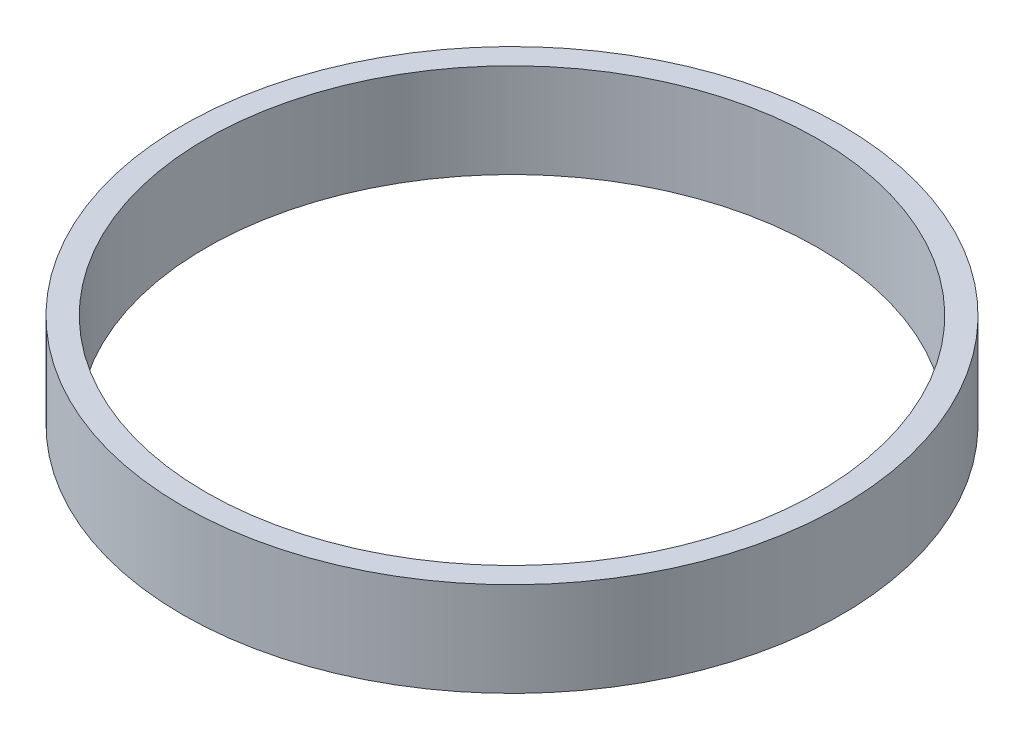
ISO-10303-21;
HEADER;
FILE_DESCRIPTION(('STEP AP214'),'2;1');
FILE_NAME('part.step','',(''),(''),'','','');
FILE_SCHEMA(('AUTOMOTIVE_DESIGN { 1 0 10303 214 1 1 1 1 }'));
ENDSEC;
DATA;
#1=APPLICATION_CONTEXT('core data for automotive mechanical design processes');
#2=APPLICATION_PROTOCOL_DEFINITION('international standard','automotive_design',2000,#1);
#3=PRODUCT_CONTEXT('',#1,'mechanical');
#4=PRODUCT('Part','Part','',(#3));
#5=PRODUCT_RELATED_PRODUCT_CATEGORY('part','',(#4));
#6=PRODUCT_DEFINITION_FORMATION('','',#4);
#7=PRODUCT_DEFINITION_CONTEXT('part definition',#1,'design');
#8=PRODUCT_DEFINITION('design','',#6,#7);
#9=PRODUCT_DEFINITION_SHAPE('','',#8);
#10=(LENGTH_UNIT() NAMED_UNIT(*) SI_UNIT(.MILLI.,.METRE.));
#11=(NAMED_UNIT(*) PLANE_ANGLE_UNIT() SI_UNIT($,.RADIAN.));
#12=(NAMED_UNIT(*) SI_UNIT($,.STERADIAN.) SOLID_ANGLE_UNIT());
#13=UNCERTAINTY_MEASURE_WITH_UNIT(LENGTH_MEASURE(1.E-05),#10,'distance_accuracy_value','');
#14=(GEOMETRIC_REPRESENTATION_CONTEXT(3) GLOBAL_UNCERTAINTY_ASSIGNED_CONTEXT((#13)) GLOBAL_UNIT_ASSIGNED_CONTEXT((#10,
#11,#12)) REPRESENTATION_CONTEXT('',''));
#15=CARTESIAN_POINT('',(0.,0.,0.));
#16=DIRECTION('',(0.,0.,1.));
#17=DIRECTION('',(1.,0.,0.));
#18=AXIS2_PLACEMENT_3D('',#15,#16,#17);
#19=CARTESIAN_POINT('',(0.,10.,0.));
#20=DIRECTION('',(0.,-1.,0.));
#21=DIRECTION('',(0.,0.,-1.));
#22=AXIS2_PLACEMENT_3D('',#19,#20,#21);
#23=CYLINDRICAL_SURFACE('',#22,35.);
#24=CARTESIAN_POINT('',(0.,10.,0.));
#25=DIRECTION('',(0.,1.,0.));
#26=DIRECTION('',(0.,0.,1.));
#27=AXIS2_PLACEMENT_3D('',#24,#25,#26);
#28=CIRCLE('',#27,35.);
#29=CARTESIAN_POINT('',(0.,10.,35.));
#30=VERTEX_POINT('',#29);
#31=EDGE_CURVE('E42',#30,#30,#28,.T.);
#32=ORIENTED_EDGE('',*,*,#31,.F.);
#33=EDGE_LOOP('',(#32));
#34=FACE_BOUND('',#33,.T.);
#35=CARTESIAN_POINT('',(0.,0.,0.));
#36=DIRECTION('',(0.,1.,0.));
#37=DIRECTION('',(0.,0.,1.));
#38=AXIS2_PLACEMENT_3D('',#35,#36,#37);
#39=CIRCLE('',#38,35.);
#40=CARTESIAN_POINT('',(0.,0.,35.));
#41=VERTEX_POINT('',#40);
#42=EDGE_CURVE('E48',#41,#41,#39,.T.);
#43=ORIENTED_EDGE('',*,*,#42,.T.);
#44=EDGE_LOOP('',(#43));
#45=FACE_BOUND('',#44,.T.);
#46=ADVANCED_FACE('F35',(#34,#45),#23,.T.);
#47=CARTESIAN_POINT('',(0.,10.,0.));
#48=DIRECTION('',(0.,-1.,0.));
#49=DIRECTION('',(0.,0.,-1.));
#50=AXIS2_PLACEMENT_3D('',#47,#48,#49);
#51=CYLINDRICAL_SURFACE('',#50,32.5);
#52=CARTESIAN_POINT('',(0.,10.,0.));
#53=DIRECTION('',(0.,1.,0.));
#54=DIRECTION('',(0.,0.,1.));
#55=AXIS2_PLACEMENT_3D('',#52,#53,#54);
#56=CIRCLE('',#55,32.5);
#57=CARTESIAN_POINT('',(0.,10.,32.5));
#58=VERTEX_POINT('',#57);
#59=EDGE_CURVE('E10',#58,#58,#56,.T.);
#60=ORIENTED_EDGE('',*,*,#59,.T.);
#61=EDGE_LOOP('',(#60));
#62=FACE_BOUND('',#61,.T.);
#63=CARTESIAN_POINT('',(0.,0.,0.));
#64=DIRECTION('',(0.,1.,0.));
#65=DIRECTION('',(0.,0.,1.));
#66=AXIS2_PLACEMENT_3D('',#63,#64,#65);
#67=CIRCLE('',#66,32.5);
#68=CARTESIAN_POINT('',(0.,0.,32.5));
#69=VERTEX_POINT('',#68);
#70=EDGE_CURVE('E38',#69,#69,#67,.T.);
#71=ORIENTED_EDGE('',*,*,#70,.F.);
#72=EDGE_LOOP('',(#71));
#73=FACE_BOUND('',#72,.T.);
#74=ADVANCED_FACE('F57',(#62,#73),#51,.F.);
#75=CARTESIAN_POINT('',(0.,10.,0.));
#76=DIRECTION('',(0.,1.,0.));
#77=DIRECTION('',(0.,0.,1.));
#78=AXIS2_PLACEMENT_3D('',#75,#76,#77);
#79=PLANE('',#78);
#80=ORIENTED_EDGE('',*,*,#31,.T.);
#81=EDGE_LOOP('',(#80));
#82=FACE_BOUND('',#81,.T.);
#83=ORIENTED_EDGE('',*,*,#59,.F.);
#84=EDGE_LOOP('',(#83));
#85=FACE_BOUND('',#84,.T.);
#86=ADVANCED_FACE('F59',(#82,#85),#79,.T.);
#87=CARTESIAN_POINT('',(0.,0.,0.));
#88=DIRECTION('',(0.,1.,0.));
#89=DIRECTION('',(0.,0.,1.));
#90=AXIS2_PLACEMENT_3D('',#87,#88,#89);
#91=PLANE('',#90);
#92=ORIENTED_EDGE('',*,*,#42,.F.);
#93=EDGE_LOOP('',(#92));
#94=FACE_BOUND('',#93,.T.);
#95=ORIENTED_EDGE('',*,*,#70,.T.);
#96=EDGE_LOOP('',(#95));
#97=FACE_BOUND('',#96,.T.);
#98=ADVANCED_FACE('F55',(#94,#97),#91,.F.);
#99=CLOSED_SHELL('',(#46,#74,#86,#98));
#100=MANIFOLD_SOLID_BREP('B2',#99);
#101=ADVANCED_BREP_SHAPE_REPRESENTATION('',(#18,#100),#14);
#102=SHAPE_DEFINITION_REPRESENTATION(#9,#101);
ENDSEC;
END-ISO-10303-21;
